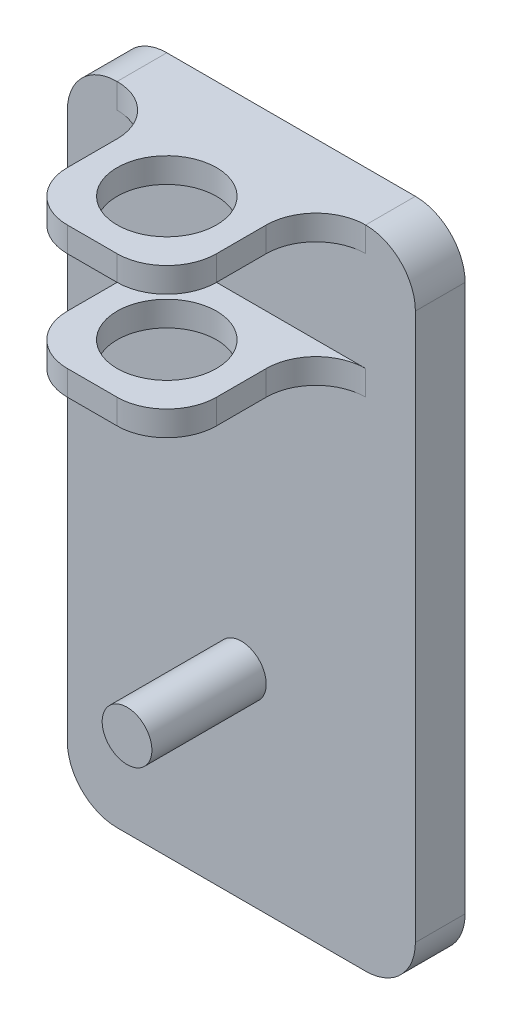
ISO-10303-21;
HEADER;
FILE_DESCRIPTION(('STEP AP214'),'2;1');
FILE_NAME('part.step','',(''),(''),'','','');
FILE_SCHEMA(('AUTOMOTIVE_DESIGN { 1 0 10303 214 1 1 1 1 }'));
ENDSEC;
DATA;
#1=APPLICATION_CONTEXT('core data for automotive mechanical design processes');
#2=APPLICATION_PROTOCOL_DEFINITION('international standard','automotive_design',2000,#1);
#3=PRODUCT_CONTEXT('',#1,'mechanical');
#4=PRODUCT('Part','Part','',(#3));
#5=PRODUCT_RELATED_PRODUCT_CATEGORY('part','',(#4));
#6=PRODUCT_DEFINITION_FORMATION('','',#4);
#7=PRODUCT_DEFINITION_CONTEXT('part definition',#1,'design');
#8=PRODUCT_DEFINITION('design','',#6,#7);
#9=PRODUCT_DEFINITION_SHAPE('','',#8);
#10=(LENGTH_UNIT() NAMED_UNIT(*) SI_UNIT(.MILLI.,.METRE.));
#11=(NAMED_UNIT(*) PLANE_ANGLE_UNIT() SI_UNIT($,.RADIAN.));
#12=(NAMED_UNIT(*) SI_UNIT($,.STERADIAN.) SOLID_ANGLE_UNIT());
#13=UNCERTAINTY_MEASURE_WITH_UNIT(LENGTH_MEASURE(1.E-05),#10,'distance_accuracy_value','');
#14=(GEOMETRIC_REPRESENTATION_CONTEXT(3) GLOBAL_UNCERTAINTY_ASSIGNED_CONTEXT((#13)) GLOBAL_UNIT_ASSIGNED_CONTEXT((#10,
#11,#12)) REPRESENTATION_CONTEXT('',''));
#15=CARTESIAN_POINT('',(0.,0.,0.));
#16=DIRECTION('',(0.,0.,1.));
#17=DIRECTION('',(1.,0.,0.));
#18=AXIS2_PLACEMENT_3D('',#15,#16,#17);
#19=CARTESIAN_POINT('',(35.,65.,5.));
#20=DIRECTION('',(-1.,0.,0.));
#21=DIRECTION('',(0.,-1.,0.));
#22=AXIS2_PLACEMENT_3D('',#19,#20,#21);
#23=PLANE('',#22);
#24=DIRECTION('',(0.,1.,0.));
#25=VECTOR('',#24,1.);
#26=CARTESIAN_POINT('',(35.,65.,5.));
#27=LINE('',#26,#25);
#28=CARTESIAN_POINT('',(35.,-55.,5.));
#29=VERTEX_POINT('',#28);
#30=CARTESIAN_POINT('',(35.,55.,5.));
#31=VERTEX_POINT('',#30);
#32=EDGE_CURVE('E222',#29,#31,#27,.T.);
#33=ORIENTED_EDGE('',*,*,#32,.F.);
#34=DIRECTION('',(0.,0.,-1.));
#35=VECTOR('',#34,1.);
#36=CARTESIAN_POINT('',(35.,-55.,5.));
#37=LINE('',#36,#35);
#38=CARTESIAN_POINT('',(35.,-55.,-5.));
#39=VERTEX_POINT('',#38);
#40=EDGE_CURVE('E206',#29,#39,#37,.T.);
#41=ORIENTED_EDGE('',*,*,#40,.T.);
#42=DIRECTION('',(0.,1.,0.));
#43=VECTOR('',#42,1.);
#44=CARTESIAN_POINT('',(35.,65.,-5.));
#45=LINE('',#44,#43);
#46=CARTESIAN_POINT('',(35.,55.,-5.));
#47=VERTEX_POINT('',#46);
#48=EDGE_CURVE('E219',#39,#47,#45,.T.);
#49=ORIENTED_EDGE('',*,*,#48,.T.);
#50=DIRECTION('',(0.,0.,-1.));
#51=VECTOR('',#50,1.);
#52=CARTESIAN_POINT('',(35.,55.,5.));
#53=LINE('',#52,#51);
#54=EDGE_CURVE('E225',#47,#31,#53,.F.);
#55=ORIENTED_EDGE('',*,*,#54,.T.);
#56=EDGE_LOOP('',(#33,#41,#49,#55));
#57=FACE_BOUND('',#56,.T.);
#58=ADVANCED_FACE('F45',(#57),#23,.F.);
#59=CARTESIAN_POINT('',(-35.,65.,5.));
#60=DIRECTION('',(0.,-1.,0.));
#61=DIRECTION('',(0.,0.,-1.));
#62=AXIS2_PLACEMENT_3D('',#59,#60,#61);
#63=PLANE('',#62);
#64=CARTESIAN_POINT('',(0.,65.,20.));
#65=DIRECTION('',(0.,-1.,0.));
#66=DIRECTION('',(0.,0.,-1.));
#67=AXIS2_PLACEMENT_3D('',#64,#65,#66);
#68=CIRCLE('',#67,10.);
#69=CARTESIAN_POINT('',(0.,65.,9.99999999999999));
#70=VERTEX_POINT('',#69);
#71=EDGE_CURVE('E598',#70,#70,#68,.T.);
#72=ORIENTED_EDGE('',*,*,#71,.T.);
#73=EDGE_LOOP('',(#72));
#74=FACE_BOUND('',#73,.T.);
#75=DIRECTION('',(0.,0.,1.));
#76=VECTOR('',#75,1.);
#77=CARTESIAN_POINT('',(-15.,65.,5.));
#78=LINE('',#77,#76);
#79=CARTESIAN_POINT('',(-15.,65.,15.));
#80=VERTEX_POINT('',#79);
#81=CARTESIAN_POINT('',(-15.,65.,25.));
#82=VERTEX_POINT('',#81);
#83=EDGE_CURVE('E432',#80,#82,#78,.T.);
#84=ORIENTED_EDGE('',*,*,#83,.T.);
#85=CARTESIAN_POINT('',(-5.,65.,25.));
#86=DIRECTION('',(0.,-1.,0.));
#87=DIRECTION('',(0.,0.,-1.));
#88=AXIS2_PLACEMENT_3D('',#85,#86,#87);
#89=CIRCLE('',#88,10.);
#90=CARTESIAN_POINT('',(-5.,65.,35.));
#91=VERTEX_POINT('',#90);
#92=EDGE_CURVE('E324',#82,#91,#89,.F.);
#93=ORIENTED_EDGE('',*,*,#92,.T.);
#94=DIRECTION('',(-1.,0.,0.));
#95=VECTOR('',#94,1.);
#96=CARTESIAN_POINT('',(-15.,65.,35.));
#97=LINE('',#96,#95);
#98=CARTESIAN_POINT('',(5.,65.,35.));
#99=VERTEX_POINT('',#98);
#100=EDGE_CURVE('E424',#99,#91,#97,.T.);
#101=ORIENTED_EDGE('',*,*,#100,.F.);
#102=CARTESIAN_POINT('',(5.,65.,25.));
#103=DIRECTION('',(0.,-1.,0.));
#104=DIRECTION('',(0.,0.,-1.));
#105=AXIS2_PLACEMENT_3D('',#102,#103,#104);
#106=CIRCLE('',#105,10.);
#107=CARTESIAN_POINT('',(15.,65.,25.));
#108=VERTEX_POINT('',#107);
#109=EDGE_CURVE('E321',#99,#108,#106,.F.);
#110=ORIENTED_EDGE('',*,*,#109,.T.);
#111=DIRECTION('',(0.,0.,1.));
#112=VECTOR('',#111,1.);
#113=CARTESIAN_POINT('',(15.,65.,5.));
#114=LINE('',#113,#112);
#115=CARTESIAN_POINT('',(15.,65.,15.));
#116=VERTEX_POINT('',#115);
#117=EDGE_CURVE('E436',#116,#108,#114,.T.);
#118=ORIENTED_EDGE('',*,*,#117,.F.);
#119=CARTESIAN_POINT('',(25.,65.,15.));
#120=DIRECTION('',(0.,-1.,0.));
#121=DIRECTION('',(0.,0.,-1.));
#122=AXIS2_PLACEMENT_3D('',#119,#120,#121);
#123=CIRCLE('',#122,10.);
#124=CARTESIAN_POINT('',(25.,65.,5.));
#125=VERTEX_POINT('',#124);
#126=EDGE_CURVE('E341',#116,#125,#123,.T.);
#127=ORIENTED_EDGE('',*,*,#126,.T.);
#128=DIRECTION('',(0.,0.,-1.));
#129=VECTOR('',#128,1.);
#130=CARTESIAN_POINT('',(25.,65.,5.));
#131=LINE('',#130,#129);
#132=CARTESIAN_POINT('',(25.,65.,-5.));
#133=VERTEX_POINT('',#132);
#134=EDGE_CURVE('E285',#125,#133,#131,.T.);
#135=ORIENTED_EDGE('',*,*,#134,.T.);
#136=DIRECTION('',(-1.,0.,0.));
#137=VECTOR('',#136,1.);
#138=CARTESIAN_POINT('',(-35.,65.,-5.));
#139=LINE('',#138,#137);
#140=CARTESIAN_POINT('',(-25.,65.,-5.));
#141=VERTEX_POINT('',#140);
#142=EDGE_CURVE('E230',#133,#141,#139,.T.);
#143=ORIENTED_EDGE('',*,*,#142,.T.);
#144=DIRECTION('',(0.,0.,-1.));
#145=VECTOR('',#144,1.);
#146=CARTESIAN_POINT('',(-25.,65.,5.));
#147=LINE('',#146,#145);
#148=CARTESIAN_POINT('',(-25.,65.,5.));
#149=VERTEX_POINT('',#148);
#150=EDGE_CURVE('E289',#141,#149,#147,.F.);
#151=ORIENTED_EDGE('',*,*,#150,.T.);
#152=CARTESIAN_POINT('',(-25.,65.,15.));
#153=DIRECTION('',(0.,-1.,0.));
#154=DIRECTION('',(0.,0.,-1.));
#155=AXIS2_PLACEMENT_3D('',#152,#153,#154);
#156=CIRCLE('',#155,10.);
#157=EDGE_CURVE('E338',#149,#80,#156,.T.);
#158=ORIENTED_EDGE('',*,*,#157,.T.);
#159=EDGE_LOOP('',(#84,#93,#101,#110,#118,#127,#135,#143,#151,#158));
#160=FACE_BOUND('',#159,.T.);
#161=ADVANCED_FACE('F476',(#74,#160),#63,.F.);
#162=CARTESIAN_POINT('',(-35.,65.,5.));
#163=DIRECTION('',(1.,0.,0.));
#164=DIRECTION('',(0.,1.,0.));
#165=AXIS2_PLACEMENT_3D('',#162,#163,#164);
#166=PLANE('',#165);
#167=DIRECTION('',(0.,-1.,0.));
#168=VECTOR('',#167,1.);
#169=CARTESIAN_POINT('',(-35.,65.,-5.));
#170=LINE('',#169,#168);
#171=CARTESIAN_POINT('',(-35.,55.,-5.));
#172=VERTEX_POINT('',#171);
#173=CARTESIAN_POINT('',(-35.,-55.,-5.));
#174=VERTEX_POINT('',#173);
#175=EDGE_CURVE('E236',#172,#174,#170,.T.);
#176=ORIENTED_EDGE('',*,*,#175,.T.);
#177=DIRECTION('',(0.,0.,-1.));
#178=VECTOR('',#177,1.);
#179=CARTESIAN_POINT('',(-35.,-55.,5.));
#180=LINE('',#179,#178);
#181=CARTESIAN_POINT('',(-35.,-55.,5.));
#182=VERTEX_POINT('',#181);
#183=EDGE_CURVE('E282',#174,#182,#180,.F.);
#184=ORIENTED_EDGE('',*,*,#183,.T.);
#185=DIRECTION('',(0.,-1.,0.));
#186=VECTOR('',#185,1.);
#187=CARTESIAN_POINT('',(-35.,65.,5.));
#188=LINE('',#187,#186);
#189=CARTESIAN_POINT('',(-35.,55.,5.));
#190=VERTEX_POINT('',#189);
#191=EDGE_CURVE('E451',#190,#182,#188,.T.);
#192=ORIENTED_EDGE('',*,*,#191,.F.);
#193=DIRECTION('',(0.,0.,-1.));
#194=VECTOR('',#193,1.);
#195=CARTESIAN_POINT('',(-35.,55.,5.));
#196=LINE('',#195,#194);
#197=EDGE_CURVE('E278',#190,#172,#196,.T.);
#198=ORIENTED_EDGE('',*,*,#197,.T.);
#199=EDGE_LOOP('',(#176,#184,#192,#198));
#200=FACE_BOUND('',#199,.T.);
#201=ADVANCED_FACE('F468',(#200),#166,.F.);
#202=CARTESIAN_POINT('',(-35.,-65.,5.));
#203=DIRECTION('',(0.,1.,0.));
#204=DIRECTION('',(0.,0.,1.));
#205=AXIS2_PLACEMENT_3D('',#202,#203,#204);
#206=PLANE('',#205);
#207=DIRECTION('',(1.,0.,0.));
#208=VECTOR('',#207,1.);
#209=CARTESIAN_POINT('',(-35.,-65.,-5.));
#210=LINE('',#209,#208);
#211=CARTESIAN_POINT('',(-25.,-65.,-5.));
#212=VERTEX_POINT('',#211);
#213=CARTESIAN_POINT('',(25.,-65.,-5.));
#214=VERTEX_POINT('',#213);
#215=EDGE_CURVE('E248',#212,#214,#210,.T.);
#216=ORIENTED_EDGE('',*,*,#215,.T.);
#217=DIRECTION('',(0.,0.,-1.));
#218=VECTOR('',#217,1.);
#219=CARTESIAN_POINT('',(25.,-65.,5.));
#220=LINE('',#219,#218);
#221=CARTESIAN_POINT('',(25.,-65.,5.));
#222=VERTEX_POINT('',#221);
#223=EDGE_CURVE('E207',#214,#222,#220,.F.);
#224=ORIENTED_EDGE('',*,*,#223,.T.);
#225=DIRECTION('',(1.,0.,0.));
#226=VECTOR('',#225,1.);
#227=CARTESIAN_POINT('',(-35.,-65.,5.));
#228=LINE('',#227,#226);
#229=CARTESIAN_POINT('',(-25.,-65.,5.));
#230=VERTEX_POINT('',#229);
#231=EDGE_CURVE('E242',#230,#222,#228,.T.);
#232=ORIENTED_EDGE('',*,*,#231,.F.);
#233=DIRECTION('',(0.,0.,-1.));
#234=VECTOR('',#233,1.);
#235=CARTESIAN_POINT('',(-25.,-65.,5.));
#236=LINE('',#235,#234);
#237=EDGE_CURVE('E213',#230,#212,#236,.T.);
#238=ORIENTED_EDGE('',*,*,#237,.T.);
#239=EDGE_LOOP('',(#216,#224,#232,#238));
#240=FACE_BOUND('',#239,.T.);
#241=ADVANCED_FACE('F462',(#240),#206,.F.);
#242=CARTESIAN_POINT('',(0.,0.,5.));
#243=DIRECTION('',(0.,0.,1.));
#244=DIRECTION('',(1.,0.,0.));
#245=AXIS2_PLACEMENT_3D('',#242,#243,#244);
#246=PLANE('',#245);
#247=DIRECTION('',(1.,0.,0.));
#248=VECTOR('',#247,1.);
#249=CARTESIAN_POINT('',(-15.,35.,5.));
#250=LINE('',#249,#248);
#251=CARTESIAN_POINT('',(-25.,35.,5.));
#252=VERTEX_POINT('',#251);
#253=CARTESIAN_POINT('',(25.,35.,5.));
#254=VERTEX_POINT('',#253);
#255=EDGE_CURVE('E403',#252,#254,#250,.T.);
#256=ORIENTED_EDGE('',*,*,#255,.F.);
#257=DIRECTION('',(0.,-1.,0.));
#258=VECTOR('',#257,1.);
#259=CARTESIAN_POINT('',(-25.,40.,5.));
#260=LINE('',#259,#258);
#261=CARTESIAN_POINT('',(-25.,40.,5.));
#262=VERTEX_POINT('',#261);
#263=EDGE_CURVE('E358',#252,#262,#260,.F.);
#264=ORIENTED_EDGE('',*,*,#263,.T.);
#265=DIRECTION('',(-1.,0.,0.));
#266=VECTOR('',#265,1.);
#267=CARTESIAN_POINT('',(-15.,40.,5.));
#268=LINE('',#267,#266);
#269=CARTESIAN_POINT('',(25.,40.,5.));
#270=VERTEX_POINT('',#269);
#271=EDGE_CURVE('E396',#270,#262,#268,.T.);
#272=ORIENTED_EDGE('',*,*,#271,.F.);
#273=DIRECTION('',(0.,1.,0.));
#274=VECTOR('',#273,1.);
#275=CARTESIAN_POINT('',(25.,35.,5.));
#276=LINE('',#275,#274);
#277=EDGE_CURVE('E354',#270,#254,#276,.F.);
#278=ORIENTED_EDGE('',*,*,#277,.T.);
#279=EDGE_LOOP('',(#256,#264,#272,#278));
#280=FACE_BOUND('',#279,.T.);
#281=DIRECTION('',(1.,0.,0.));
#282=VECTOR('',#281,1.);
#283=CARTESIAN_POINT('',(-15.,60.,5.));
#284=LINE('',#283,#282);
#285=CARTESIAN_POINT('',(-25.,60.,5.));
#286=VERTEX_POINT('',#285);
#287=CARTESIAN_POINT('',(25.,60.,5.));
#288=VERTEX_POINT('',#287);
#289=EDGE_CURVE('E420',#286,#288,#284,.T.);
#290=ORIENTED_EDGE('',*,*,#289,.F.);
#291=DIRECTION('',(0.,-1.,0.));
#292=VECTOR('',#291,1.);
#293=CARTESIAN_POINT('',(-25.,65.,5.));
#294=LINE('',#293,#292);
#295=EDGE_CURVE('E304',#286,#149,#294,.F.);
#296=ORIENTED_EDGE('',*,*,#295,.T.);
#297=CARTESIAN_POINT('',(-25.,55.,5.));
#298=DIRECTION('',(0.,0.,1.));
#299=DIRECTION('',(1.,0.,0.));
#300=AXIS2_PLACEMENT_3D('',#297,#298,#299);
#301=CIRCLE('',#300,10.);
#302=EDGE_CURVE('E269',#149,#190,#301,.T.);
#303=ORIENTED_EDGE('',*,*,#302,.T.);
#304=ORIENTED_EDGE('',*,*,#191,.T.);
#305=CARTESIAN_POINT('',(-25.,-55.,5.));
#306=DIRECTION('',(0.,0.,1.));
#307=DIRECTION('',(1.,0.,0.));
#308=AXIS2_PLACEMENT_3D('',#305,#306,#307);
#309=CIRCLE('',#308,10.);
#310=EDGE_CURVE('E272',#182,#230,#309,.T.);
#311=ORIENTED_EDGE('',*,*,#310,.T.);
#312=ORIENTED_EDGE('',*,*,#231,.T.);
#313=CARTESIAN_POINT('',(25.,-55.,5.));
#314=DIRECTION('',(0.,0.,1.));
#315=DIRECTION('',(1.,0.,0.));
#316=AXIS2_PLACEMENT_3D('',#313,#314,#315);
#317=CIRCLE('',#316,10.);
#318=EDGE_CURVE('E275',#222,#29,#317,.T.);
#319=ORIENTED_EDGE('',*,*,#318,.T.);
#320=ORIENTED_EDGE('',*,*,#32,.T.);
#321=CARTESIAN_POINT('',(25.,55.,5.));
#322=DIRECTION('',(0.,0.,1.));
#323=DIRECTION('',(1.,0.,0.));
#324=AXIS2_PLACEMENT_3D('',#321,#322,#323);
#325=CIRCLE('',#324,10.);
#326=EDGE_CURVE('E265',#31,#125,#325,.T.);
#327=ORIENTED_EDGE('',*,*,#326,.T.);
#328=DIRECTION('',(0.,1.,0.));
#329=VECTOR('',#328,1.);
#330=CARTESIAN_POINT('',(25.,60.,5.));
#331=LINE('',#330,#329);
#332=EDGE_CURVE('E300',#125,#288,#331,.F.);
#333=ORIENTED_EDGE('',*,*,#332,.T.);
#334=EDGE_LOOP('',(#290,#296,#303,#304,#311,#312,#319,#320,#327,#333));
#335=FACE_BOUND('',#334,.T.);
#336=CARTESIAN_POINT('',(0.,-25.,5.));
#337=DIRECTION('',(0.,0.,1.));
#338=DIRECTION('',(1.,0.,0.));
#339=AXIS2_PLACEMENT_3D('',#336,#337,#338);
#340=CIRCLE('',#339,5.);
#341=CARTESIAN_POINT('',(5.,-25.,5.));
#342=VERTEX_POINT('',#341);
#343=EDGE_CURVE('E239',#342,#342,#340,.T.);
#344=ORIENTED_EDGE('',*,*,#343,.F.);
#345=EDGE_LOOP('',(#344));
#346=FACE_BOUND('',#345,.T.);
#347=ADVANCED_FACE('F401',(#280,#335,#346),#246,.T.);
#348=CARTESIAN_POINT('',(0.,0.,-5.));
#349=DIRECTION('',(0.,0.,1.));
#350=DIRECTION('',(1.,0.,0.));
#351=AXIS2_PLACEMENT_3D('',#348,#349,#350);
#352=PLANE('',#351);
#353=ORIENTED_EDGE('',*,*,#48,.F.);
#354=CARTESIAN_POINT('',(25.,-55.,-5.));
#355=DIRECTION('',(0.,0.,1.));
#356=DIRECTION('',(1.,0.,0.));
#357=AXIS2_PLACEMENT_3D('',#354,#355,#356);
#358=CIRCLE('',#357,10.);
#359=EDGE_CURVE('E202',#39,#214,#358,.F.);
#360=ORIENTED_EDGE('',*,*,#359,.T.);
#361=ORIENTED_EDGE('',*,*,#215,.F.);
#362=CARTESIAN_POINT('',(-25.,-55.,-5.));
#363=DIRECTION('',(0.,0.,1.));
#364=DIRECTION('',(1.,0.,0.));
#365=AXIS2_PLACEMENT_3D('',#362,#363,#364);
#366=CIRCLE('',#365,10.);
#367=EDGE_CURVE('E214',#212,#174,#366,.F.);
#368=ORIENTED_EDGE('',*,*,#367,.T.);
#369=ORIENTED_EDGE('',*,*,#175,.F.);
#370=CARTESIAN_POINT('',(-25.,55.,-5.));
#371=DIRECTION('',(0.,0.,1.));
#372=DIRECTION('',(1.,0.,0.));
#373=AXIS2_PLACEMENT_3D('',#370,#371,#372);
#374=CIRCLE('',#373,10.);
#375=EDGE_CURVE('E255',#172,#141,#374,.F.);
#376=ORIENTED_EDGE('',*,*,#375,.T.);
#377=ORIENTED_EDGE('',*,*,#142,.F.);
#378=CARTESIAN_POINT('',(25.,55.,-5.));
#379=DIRECTION('',(0.,0.,1.));
#380=DIRECTION('',(1.,0.,0.));
#381=AXIS2_PLACEMENT_3D('',#378,#379,#380);
#382=CIRCLE('',#381,10.);
#383=EDGE_CURVE('E224',#133,#47,#382,.F.);
#384=ORIENTED_EDGE('',*,*,#383,.T.);
#385=EDGE_LOOP('',(#353,#360,#361,#368,#369,#376,#377,#384));
#386=FACE_BOUND('',#385,.T.);
#387=ADVANCED_FACE('F227',(#386),#352,.F.);
#388=CARTESIAN_POINT('',(25.,-55.,5.));
#389=DIRECTION('',(0.,0.,-1.));
#390=DIRECTION('',(-1.,0.,0.));
#391=AXIS2_PLACEMENT_3D('',#388,#389,#390);
#392=CYLINDRICAL_SURFACE('',#391,10.);
#393=ORIENTED_EDGE('',*,*,#318,.F.);
#394=ORIENTED_EDGE('',*,*,#223,.F.);
#395=ORIENTED_EDGE('',*,*,#359,.F.);
#396=ORIENTED_EDGE('',*,*,#40,.F.);
#397=EDGE_LOOP('',(#393,#394,#395,#396));
#398=FACE_BOUND('',#397,.T.);
#399=ADVANCED_FACE('F205',(#398),#392,.T.);
#400=CARTESIAN_POINT('',(-25.,-55.,5.));
#401=DIRECTION('',(0.,0.,-1.));
#402=DIRECTION('',(-1.,0.,0.));
#403=AXIS2_PLACEMENT_3D('',#400,#401,#402);
#404=CYLINDRICAL_SURFACE('',#403,10.);
#405=ORIENTED_EDGE('',*,*,#310,.F.);
#406=ORIENTED_EDGE('',*,*,#183,.F.);
#407=ORIENTED_EDGE('',*,*,#367,.F.);
#408=ORIENTED_EDGE('',*,*,#237,.F.);
#409=EDGE_LOOP('',(#405,#406,#407,#408));
#410=FACE_BOUND('',#409,.T.);
#411=ADVANCED_FACE('F464',(#410),#404,.T.);
#412=CARTESIAN_POINT('',(-25.,55.,5.));
#413=DIRECTION('',(0.,0.,-1.));
#414=DIRECTION('',(-1.,0.,0.));
#415=AXIS2_PLACEMENT_3D('',#412,#413,#414);
#416=CYLINDRICAL_SURFACE('',#415,10.);
#417=ORIENTED_EDGE('',*,*,#302,.F.);
#418=ORIENTED_EDGE('',*,*,#150,.F.);
#419=ORIENTED_EDGE('',*,*,#375,.F.);
#420=ORIENTED_EDGE('',*,*,#197,.F.);
#421=EDGE_LOOP('',(#417,#418,#419,#420));
#422=FACE_BOUND('',#421,.T.);
#423=ADVANCED_FACE('F472',(#422),#416,.T.);
#424=CARTESIAN_POINT('',(25.,55.,5.));
#425=DIRECTION('',(0.,0.,-1.));
#426=DIRECTION('',(-1.,0.,0.));
#427=AXIS2_PLACEMENT_3D('',#424,#425,#426);
#428=CYLINDRICAL_SURFACE('',#427,10.);
#429=ORIENTED_EDGE('',*,*,#326,.F.);
#430=ORIENTED_EDGE('',*,*,#54,.F.);
#431=ORIENTED_EDGE('',*,*,#383,.F.);
#432=ORIENTED_EDGE('',*,*,#134,.F.);
#433=EDGE_LOOP('',(#429,#430,#431,#432));
#434=FACE_BOUND('',#433,.T.);
#435=ADVANCED_FACE('F482',(#434),#428,.T.);
#436=CARTESIAN_POINT('',(0.,-25.,28.));
#437=DIRECTION('',(0.,0.,-1.));
#438=DIRECTION('',(-1.,0.,0.));
#439=AXIS2_PLACEMENT_3D('',#436,#437,#438);
#440=CYLINDRICAL_SURFACE('',#439,5.);
#441=CARTESIAN_POINT('',(0.,-25.,28.));
#442=DIRECTION('',(0.,0.,1.));
#443=DIRECTION('',(1.,0.,0.));
#444=AXIS2_PLACEMENT_3D('',#441,#442,#443);
#445=CIRCLE('',#444,5.);
#446=CARTESIAN_POINT('',(5.,-25.,28.));
#447=VERTEX_POINT('',#446);
#448=EDGE_CURVE('E231',#447,#447,#445,.T.);
#449=ORIENTED_EDGE('',*,*,#448,.F.);
#450=EDGE_LOOP('',(#449));
#451=FACE_BOUND('',#450,.T.);
#452=ORIENTED_EDGE('',*,*,#343,.T.);
#453=EDGE_LOOP('',(#452));
#454=FACE_BOUND('',#453,.T.);
#455=ADVANCED_FACE('F543',(#451,#454),#440,.T.);
#456=CARTESIAN_POINT('',(0.,-25.,28.));
#457=DIRECTION('',(0.,0.,1.));
#458=DIRECTION('',(1.,0.,0.));
#459=AXIS2_PLACEMENT_3D('',#456,#457,#458);
#460=PLANE('',#459);
#461=ORIENTED_EDGE('',*,*,#448,.T.);
#462=EDGE_LOOP('',(#461));
#463=FACE_BOUND('',#462,.T.);
#464=ADVANCED_FACE('F522',(#463),#460,.T.);
#465=CARTESIAN_POINT('',(-15.,65.,5.));
#466=DIRECTION('',(-1.,0.,0.));
#467=DIRECTION('',(0.,-1.,0.));
#468=AXIS2_PLACEMENT_3D('',#465,#466,#467);
#469=PLANE('',#468);
#470=ORIENTED_EDGE('',*,*,#83,.F.);
#471=DIRECTION('',(0.,-1.,0.));
#472=VECTOR('',#471,1.);
#473=CARTESIAN_POINT('',(-15.,60.,15.));
#474=LINE('',#473,#472);
#475=CARTESIAN_POINT('',(-15.,60.,15.));
#476=VERTEX_POINT('',#475);
#477=EDGE_CURVE('E296',#80,#476,#474,.T.);
#478=ORIENTED_EDGE('',*,*,#477,.T.);
#479=DIRECTION('',(0.,0.,1.));
#480=VECTOR('',#479,1.);
#481=CARTESIAN_POINT('',(-15.,60.,5.));
#482=LINE('',#481,#480);
#483=CARTESIAN_POINT('',(-15.,60.,25.));
#484=VERTEX_POINT('',#483);
#485=EDGE_CURVE('E423',#476,#484,#482,.T.);
#486=ORIENTED_EDGE('',*,*,#485,.T.);
#487=DIRECTION('',(0.,-1.,0.));
#488=VECTOR('',#487,1.);
#489=CARTESIAN_POINT('',(-15.,65.,25.));
#490=LINE('',#489,#488);
#491=EDGE_CURVE('E293',#484,#82,#490,.F.);
#492=ORIENTED_EDGE('',*,*,#491,.T.);
#493=EDGE_LOOP('',(#470,#478,#486,#492));
#494=FACE_BOUND('',#493,.T.);
#495=ADVANCED_FACE('F498',(#494),#469,.T.);
#496=CARTESIAN_POINT('',(15.,65.,5.));
#497=DIRECTION('',(1.,0.,0.));
#498=DIRECTION('',(0.,1.,0.));
#499=AXIS2_PLACEMENT_3D('',#496,#497,#498);
#500=PLANE('',#499);
#501=DIRECTION('',(0.,0.,1.));
#502=VECTOR('',#501,1.);
#503=CARTESIAN_POINT('',(15.,60.,5.));
#504=LINE('',#503,#502);
#505=CARTESIAN_POINT('',(15.,60.,15.));
#506=VERTEX_POINT('',#505);
#507=CARTESIAN_POINT('',(15.,60.,25.));
#508=VERTEX_POINT('',#507);
#509=EDGE_CURVE('E440',#506,#508,#504,.T.);
#510=ORIENTED_EDGE('',*,*,#509,.F.);
#511=DIRECTION('',(0.,1.,0.));
#512=VECTOR('',#511,1.);
#513=CARTESIAN_POINT('',(15.,65.,15.));
#514=LINE('',#513,#512);
#515=EDGE_CURVE('E330',#506,#116,#514,.T.);
#516=ORIENTED_EDGE('',*,*,#515,.T.);
#517=ORIENTED_EDGE('',*,*,#117,.T.);
#518=DIRECTION('',(0.,1.,0.));
#519=VECTOR('',#518,1.);
#520=CARTESIAN_POINT('',(15.,65.,25.));
#521=LINE('',#520,#519);
#522=EDGE_CURVE('E327',#108,#508,#521,.F.);
#523=ORIENTED_EDGE('',*,*,#522,.T.);
#524=EDGE_LOOP('',(#510,#516,#517,#523));
#525=FACE_BOUND('',#524,.T.);
#526=ADVANCED_FACE('F513',(#525),#500,.T.);
#527=CARTESIAN_POINT('',(-15.,60.,5.));
#528=DIRECTION('',(0.,-1.,0.));
#529=DIRECTION('',(0.,0.,-1.));
#530=AXIS2_PLACEMENT_3D('',#527,#528,#529);
#531=PLANE('',#530);
#532=CARTESIAN_POINT('',(0.,60.,20.));
#533=DIRECTION('',(0.,-1.,0.));
#534=DIRECTION('',(0.,0.,-1.));
#535=AXIS2_PLACEMENT_3D('',#532,#533,#534);
#536=CIRCLE('',#535,10.);
#537=CARTESIAN_POINT('',(0.,60.,9.99999999999999));
#538=VERTEX_POINT('',#537);
#539=EDGE_CURVE('E586',#538,#538,#536,.T.);
#540=ORIENTED_EDGE('',*,*,#539,.F.);
#541=EDGE_LOOP('',(#540));
#542=FACE_BOUND('',#541,.T.);
#543=DIRECTION('',(1.,0.,0.));
#544=VECTOR('',#543,1.);
#545=CARTESIAN_POINT('',(-15.,60.,35.));
#546=LINE('',#545,#544);
#547=CARTESIAN_POINT('',(-5.,60.,35.));
#548=VERTEX_POINT('',#547);
#549=CARTESIAN_POINT('',(5.,60.,35.));
#550=VERTEX_POINT('',#549);
#551=EDGE_CURVE('E425',#548,#550,#546,.T.);
#552=ORIENTED_EDGE('',*,*,#551,.F.);
#553=CARTESIAN_POINT('',(-5.,60.,25.));
#554=DIRECTION('',(0.,-1.,0.));
#555=DIRECTION('',(0.,0.,-1.));
#556=AXIS2_PLACEMENT_3D('',#553,#554,#555);
#557=CIRCLE('',#556,10.);
#558=EDGE_CURVE('E318',#548,#484,#557,.T.);
#559=ORIENTED_EDGE('',*,*,#558,.T.);
#560=ORIENTED_EDGE('',*,*,#485,.F.);
#561=CARTESIAN_POINT('',(-25.,60.,15.));
#562=DIRECTION('',(0.,-1.,0.));
#563=DIRECTION('',(0.,0.,-1.));
#564=AXIS2_PLACEMENT_3D('',#561,#562,#563);
#565=CIRCLE('',#564,10.);
#566=EDGE_CURVE('E334',#476,#286,#565,.F.);
#567=ORIENTED_EDGE('',*,*,#566,.T.);
#568=ORIENTED_EDGE('',*,*,#289,.T.);
#569=CARTESIAN_POINT('',(25.,60.,15.));
#570=DIRECTION('',(0.,-1.,0.));
#571=DIRECTION('',(0.,0.,-1.));
#572=AXIS2_PLACEMENT_3D('',#569,#570,#571);
#573=CIRCLE('',#572,10.);
#574=EDGE_CURVE('E344',#288,#506,#573,.F.);
#575=ORIENTED_EDGE('',*,*,#574,.T.);
#576=ORIENTED_EDGE('',*,*,#509,.T.);
#577=CARTESIAN_POINT('',(5.,60.,25.));
#578=DIRECTION('',(0.,-1.,0.));
#579=DIRECTION('',(0.,0.,-1.));
#580=AXIS2_PLACEMENT_3D('',#577,#578,#579);
#581=CIRCLE('',#580,10.);
#582=EDGE_CURVE('E315',#508,#550,#581,.T.);
#583=ORIENTED_EDGE('',*,*,#582,.T.);
#584=EDGE_LOOP('',(#552,#559,#560,#567,#568,#575,#576,#583));
#585=FACE_BOUND('',#584,.T.);
#586=ADVANCED_FACE('F491',(#542,#585),#531,.T.);
#587=CARTESIAN_POINT('',(0.,0.,35.));
#588=DIRECTION('',(0.,0.,1.));
#589=DIRECTION('',(1.,0.,0.));
#590=AXIS2_PLACEMENT_3D('',#587,#588,#589);
#591=PLANE('',#590);
#592=ORIENTED_EDGE('',*,*,#100,.T.);
#593=DIRECTION('',(0.,-1.,0.));
#594=VECTOR('',#593,1.);
#595=CARTESIAN_POINT('',(-5.00000000000002,0.,35.));
#596=LINE('',#595,#594);
#597=EDGE_CURVE('E311',#91,#548,#596,.T.);
#598=ORIENTED_EDGE('',*,*,#597,.T.);
#599=ORIENTED_EDGE('',*,*,#551,.T.);
#600=DIRECTION('',(0.,1.,0.));
#601=VECTOR('',#600,1.);
#602=CARTESIAN_POINT('',(5.00000000000002,0.,35.));
#603=LINE('',#602,#601);
#604=EDGE_CURVE('E307',#550,#99,#603,.T.);
#605=ORIENTED_EDGE('',*,*,#604,.T.);
#606=EDGE_LOOP('',(#592,#598,#599,#605));
#607=FACE_BOUND('',#606,.T.);
#608=ADVANCED_FACE('F505',(#607),#591,.T.);
#609=CARTESIAN_POINT('',(-15.,40.,5.));
#610=DIRECTION('',(-1.,0.,0.));
#611=DIRECTION('',(0.,0.,1.));
#612=AXIS2_PLACEMENT_3D('',#609,#610,#611);
#613=PLANE('',#612);
#614=DIRECTION('',(0.,0.,1.));
#615=VECTOR('',#614,1.);
#616=CARTESIAN_POINT('',(-15.,40.,5.));
#617=LINE('',#616,#615);
#618=CARTESIAN_POINT('',(-15.,40.,15.));
#619=VERTEX_POINT('',#618);
#620=CARTESIAN_POINT('',(-15.,40.,25.));
#621=VERTEX_POINT('',#620);
#622=EDGE_CURVE('E583',#619,#621,#617,.T.);
#623=ORIENTED_EDGE('',*,*,#622,.F.);
#624=DIRECTION('',(0.,-1.,0.));
#625=VECTOR('',#624,1.);
#626=CARTESIAN_POINT('',(-15.,35.,15.));
#627=LINE('',#626,#625);
#628=CARTESIAN_POINT('',(-15.,35.,15.));
#629=VERTEX_POINT('',#628);
#630=EDGE_CURVE('E350',#619,#629,#627,.T.);
#631=ORIENTED_EDGE('',*,*,#630,.T.);
#632=DIRECTION('',(0.,0.,1.));
#633=VECTOR('',#632,1.);
#634=CARTESIAN_POINT('',(-15.,35.,5.));
#635=LINE('',#634,#633);
#636=CARTESIAN_POINT('',(-15.,35.,25.));
#637=VERTEX_POINT('',#636);
#638=EDGE_CURVE('E407',#629,#637,#635,.T.);
#639=ORIENTED_EDGE('',*,*,#638,.T.);
#640=DIRECTION('',(0.,-1.,0.));
#641=VECTOR('',#640,1.);
#642=CARTESIAN_POINT('',(-15.,40.,25.));
#643=LINE('',#642,#641);
#644=EDGE_CURVE('E347',#637,#621,#643,.F.);
#645=ORIENTED_EDGE('',*,*,#644,.T.);
#646=EDGE_LOOP('',(#623,#631,#639,#645));
#647=FACE_BOUND('',#646,.T.);
#648=ADVANCED_FACE('F616',(#647),#613,.T.);
#649=CARTESIAN_POINT('',(-15.,40.,5.));
#650=DIRECTION('',(0.,1.,0.));
#651=DIRECTION('',(0.,0.,1.));
#652=AXIS2_PLACEMENT_3D('',#649,#650,#651);
#653=PLANE('',#652);
#654=CARTESIAN_POINT('',(0.,40.,20.));
#655=DIRECTION('',(0.,1.,0.));
#656=DIRECTION('',(0.,0.,1.));
#657=AXIS2_PLACEMENT_3D('',#654,#655,#656);
#658=CIRCLE('',#657,10.);
#659=CARTESIAN_POINT('',(0.,40.,30.));
#660=VERTEX_POINT('',#659);
#661=EDGE_CURVE('E594',#660,#660,#658,.T.);
#662=ORIENTED_EDGE('',*,*,#661,.F.);
#663=EDGE_LOOP('',(#662));
#664=FACE_BOUND('',#663,.T.);
#665=ORIENTED_EDGE('',*,*,#622,.T.);
#666=CARTESIAN_POINT('',(-5.,40.,25.));
#667=DIRECTION('',(0.,1.,0.));
#668=DIRECTION('',(0.,0.,1.));
#669=AXIS2_PLACEMENT_3D('',#666,#667,#668);
#670=CIRCLE('',#669,10.);
#671=CARTESIAN_POINT('',(-5.,40.,35.));
#672=VERTEX_POINT('',#671);
#673=EDGE_CURVE('E378',#621,#672,#670,.T.);
#674=ORIENTED_EDGE('',*,*,#673,.T.);
#675=DIRECTION('',(-1.,0.,0.));
#676=VECTOR('',#675,1.);
#677=CARTESIAN_POINT('',(-15.,40.,35.));
#678=LINE('',#677,#676);
#679=CARTESIAN_POINT('',(5.,40.,35.));
#680=VERTEX_POINT('',#679);
#681=EDGE_CURVE('E411',#680,#672,#678,.T.);
#682=ORIENTED_EDGE('',*,*,#681,.F.);
#683=CARTESIAN_POINT('',(5.,40.,25.));
#684=DIRECTION('',(0.,1.,0.));
#685=DIRECTION('',(0.,0.,1.));
#686=AXIS2_PLACEMENT_3D('',#683,#684,#685);
#687=CIRCLE('',#686,10.);
#688=CARTESIAN_POINT('',(15.,40.,25.));
#689=VERTEX_POINT('',#688);
#690=EDGE_CURVE('E61',#680,#689,#687,.T.);
#691=ORIENTED_EDGE('',*,*,#690,.T.);
#692=DIRECTION('',(0.,0.,1.));
#693=VECTOR('',#692,1.);
#694=CARTESIAN_POINT('',(15.,40.,5.));
#695=LINE('',#694,#693);
#696=CARTESIAN_POINT('',(15.,40.,15.));
#697=VERTEX_POINT('',#696);
#698=EDGE_CURVE('E397',#697,#689,#695,.T.);
#699=ORIENTED_EDGE('',*,*,#698,.F.);
#700=CARTESIAN_POINT('',(25.,40.,15.));
#701=DIRECTION('',(0.,1.,0.));
#702=DIRECTION('',(0.,0.,1.));
#703=AXIS2_PLACEMENT_3D('',#700,#701,#702);
#704=CIRCLE('',#703,10.);
#705=EDGE_CURVE('E54',#697,#270,#704,.F.);
#706=ORIENTED_EDGE('',*,*,#705,.T.);
#707=ORIENTED_EDGE('',*,*,#271,.T.);
#708=CARTESIAN_POINT('',(-25.,40.,15.));
#709=DIRECTION('',(0.,1.,0.));
#710=DIRECTION('',(0.,0.,1.));
#711=AXIS2_PLACEMENT_3D('',#708,#709,#710);
#712=CIRCLE('',#711,10.);
#713=EDGE_CURVE('E391',#262,#619,#712,.F.);
#714=ORIENTED_EDGE('',*,*,#713,.T.);
#715=EDGE_LOOP('',(#665,#674,#682,#691,#699,#706,#707,#714));
#716=FACE_BOUND('',#715,.T.);
#717=ADVANCED_FACE('F395',(#664,#716),#653,.T.);
#718=CARTESIAN_POINT('',(15.,40.,5.));
#719=DIRECTION('',(1.,0.,0.));
#720=DIRECTION('',(0.,0.,-1.));
#721=AXIS2_PLACEMENT_3D('',#718,#719,#720);
#722=PLANE('',#721);
#723=DIRECTION('',(0.,0.,1.));
#724=VECTOR('',#723,1.);
#725=CARTESIAN_POINT('',(15.,35.,5.));
#726=LINE('',#725,#724);
#727=CARTESIAN_POINT('',(15.,35.,15.));
#728=VERTEX_POINT('',#727);
#729=CARTESIAN_POINT('',(15.,35.,25.));
#730=VERTEX_POINT('',#729);
#731=EDGE_CURVE('E414',#728,#730,#726,.T.);
#732=ORIENTED_EDGE('',*,*,#731,.F.);
#733=DIRECTION('',(0.,1.,0.));
#734=VECTOR('',#733,1.);
#735=CARTESIAN_POINT('',(15.,40.,15.));
#736=LINE('',#735,#734);
#737=EDGE_CURVE('E384',#728,#697,#736,.T.);
#738=ORIENTED_EDGE('',*,*,#737,.T.);
#739=ORIENTED_EDGE('',*,*,#698,.T.);
#740=DIRECTION('',(0.,1.,0.));
#741=VECTOR('',#740,1.);
#742=CARTESIAN_POINT('',(15.,40.,25.));
#743=LINE('',#742,#741);
#744=EDGE_CURVE('E381',#689,#730,#743,.F.);
#745=ORIENTED_EDGE('',*,*,#744,.T.);
#746=EDGE_LOOP('',(#732,#738,#739,#745));
#747=FACE_BOUND('',#746,.T.);
#748=ADVANCED_FACE('F622',(#747),#722,.T.);
#749=CARTESIAN_POINT('',(-15.,35.,5.));
#750=DIRECTION('',(0.,-1.,0.));
#751=DIRECTION('',(0.,0.,-1.));
#752=AXIS2_PLACEMENT_3D('',#749,#750,#751);
#753=PLANE('',#752);
#754=CARTESIAN_POINT('',(0.,35.,20.));
#755=DIRECTION('',(0.,-1.,0.));
#756=DIRECTION('',(0.,0.,-1.));
#757=AXIS2_PLACEMENT_3D('',#754,#755,#756);
#758=CIRCLE('',#757,10.);
#759=CARTESIAN_POINT('',(0.,35.,9.99999999999999));
#760=VERTEX_POINT('',#759);
#761=EDGE_CURVE('E599',#760,#760,#758,.T.);
#762=ORIENTED_EDGE('',*,*,#761,.F.);
#763=EDGE_LOOP('',(#762));
#764=FACE_BOUND('',#763,.T.);
#765=DIRECTION('',(1.,0.,0.));
#766=VECTOR('',#765,1.);
#767=CARTESIAN_POINT('',(-15.,35.,35.));
#768=LINE('',#767,#766);
#769=CARTESIAN_POINT('',(-5.,35.,35.));
#770=VERTEX_POINT('',#769);
#771=CARTESIAN_POINT('',(5.,35.,35.));
#772=VERTEX_POINT('',#771);
#773=EDGE_CURVE('E417',#770,#772,#768,.T.);
#774=ORIENTED_EDGE('',*,*,#773,.F.);
#775=CARTESIAN_POINT('',(-5.,35.,25.));
#776=DIRECTION('',(0.,-1.,0.));
#777=DIRECTION('',(0.,0.,-1.));
#778=AXIS2_PLACEMENT_3D('',#775,#776,#777);
#779=CIRCLE('',#778,10.);
#780=EDGE_CURVE('E373',#770,#637,#779,.T.);
#781=ORIENTED_EDGE('',*,*,#780,.T.);
#782=ORIENTED_EDGE('',*,*,#638,.F.);
#783=CARTESIAN_POINT('',(-25.,35.,15.));
#784=DIRECTION('',(0.,-1.,0.));
#785=DIRECTION('',(0.,0.,-1.));
#786=AXIS2_PLACEMENT_3D('',#783,#784,#785);
#787=CIRCLE('',#786,10.);
#788=EDGE_CURVE('E387',#629,#252,#787,.F.);
#789=ORIENTED_EDGE('',*,*,#788,.T.);
#790=ORIENTED_EDGE('',*,*,#255,.T.);
#791=CARTESIAN_POINT('',(25.,35.,15.));
#792=DIRECTION('',(0.,-1.,0.));
#793=DIRECTION('',(0.,0.,-1.));
#794=AXIS2_PLACEMENT_3D('',#791,#792,#793);
#795=CIRCLE('',#794,10.);
#796=EDGE_CURVE('E11',#254,#728,#795,.F.);
#797=ORIENTED_EDGE('',*,*,#796,.T.);
#798=ORIENTED_EDGE('',*,*,#731,.T.);
#799=CARTESIAN_POINT('',(5.,35.,25.));
#800=DIRECTION('',(0.,-1.,0.));
#801=DIRECTION('',(0.,0.,-1.));
#802=AXIS2_PLACEMENT_3D('',#799,#800,#801);
#803=CIRCLE('',#802,10.);
#804=EDGE_CURVE('E370',#730,#772,#803,.T.);
#805=ORIENTED_EDGE('',*,*,#804,.T.);
#806=EDGE_LOOP('',(#774,#781,#782,#789,#790,#797,#798,#805));
#807=FACE_BOUND('',#806,.T.);
#808=ADVANCED_FACE('F574',(#764,#807),#753,.T.);
#809=CARTESIAN_POINT('',(0.,0.,35.));
#810=DIRECTION('',(0.,0.,1.));
#811=DIRECTION('',(1.,0.,0.));
#812=AXIS2_PLACEMENT_3D('',#809,#810,#811);
#813=PLANE('',#812);
#814=ORIENTED_EDGE('',*,*,#681,.T.);
#815=DIRECTION('',(0.,-1.,0.));
#816=VECTOR('',#815,1.);
#817=CARTESIAN_POINT('',(-5.,0.,35.));
#818=LINE('',#817,#816);
#819=EDGE_CURVE('E366',#672,#770,#818,.T.);
#820=ORIENTED_EDGE('',*,*,#819,.T.);
#821=ORIENTED_EDGE('',*,*,#773,.T.);
#822=DIRECTION('',(0.,1.,0.));
#823=VECTOR('',#822,1.);
#824=CARTESIAN_POINT('',(5.,0.,35.));
#825=LINE('',#824,#823);
#826=EDGE_CURVE('E362',#772,#680,#825,.T.);
#827=ORIENTED_EDGE('',*,*,#826,.T.);
#828=EDGE_LOOP('',(#814,#820,#821,#827));
#829=FACE_BOUND('',#828,.T.);
#830=ADVANCED_FACE('F578',(#829),#813,.T.);
#831=CARTESIAN_POINT('',(0.,65.,20.));
#832=DIRECTION('',(0.,-1.,0.));
#833=DIRECTION('',(0.,0.,-1.));
#834=AXIS2_PLACEMENT_3D('',#831,#832,#833);
#835=CYLINDRICAL_SURFACE('',#834,10.);
#836=ORIENTED_EDGE('',*,*,#661,.T.);
#837=EDGE_LOOP('',(#836));
#838=FACE_BOUND('',#837,.T.);
#839=ORIENTED_EDGE('',*,*,#761,.T.);
#840=EDGE_LOOP('',(#839));
#841=FACE_BOUND('',#840,.T.);
#842=ADVANCED_FACE('F608',(#838,#841),#835,.F.);
#843=ORIENTED_EDGE('',*,*,#539,.T.);
#844=EDGE_LOOP('',(#843));
#845=FACE_BOUND('',#844,.T.);
#846=ORIENTED_EDGE('',*,*,#71,.F.);
#847=EDGE_LOOP('',(#846));
#848=FACE_BOUND('',#847,.T.);
#849=ADVANCED_FACE('F546',(#845,#848),#835,.F.);
#850=CARTESIAN_POINT('',(-25.,65.,15.));
#851=DIRECTION('',(0.,1.,0.));
#852=DIRECTION('',(-1.,0.,0.));
#853=AXIS2_PLACEMENT_3D('',#850,#851,#852);
#854=CYLINDRICAL_SURFACE('',#853,10.);
#855=ORIENTED_EDGE('',*,*,#157,.F.);
#856=ORIENTED_EDGE('',*,*,#295,.F.);
#857=ORIENTED_EDGE('',*,*,#566,.F.);
#858=ORIENTED_EDGE('',*,*,#477,.F.);
#859=EDGE_LOOP('',(#855,#856,#857,#858));
#860=FACE_BOUND('',#859,.T.);
#861=ADVANCED_FACE('F494',(#860),#854,.F.);
#862=CARTESIAN_POINT('',(-5.00000000000002,0.,25.));
#863=DIRECTION('',(0.,-1.,0.));
#864=DIRECTION('',(1.,0.,0.));
#865=AXIS2_PLACEMENT_3D('',#862,#863,#864);
#866=CYLINDRICAL_SURFACE('',#865,10.);
#867=ORIENTED_EDGE('',*,*,#92,.F.);
#868=ORIENTED_EDGE('',*,*,#491,.F.);
#869=ORIENTED_EDGE('',*,*,#558,.F.);
#870=ORIENTED_EDGE('',*,*,#597,.F.);
#871=EDGE_LOOP('',(#867,#868,#869,#870));
#872=FACE_BOUND('',#871,.T.);
#873=ADVANCED_FACE('F501',(#872),#866,.T.);
#874=CARTESIAN_POINT('',(25.,65.,15.));
#875=DIRECTION('',(0.,-1.,0.));
#876=DIRECTION('',(1.,0.,0.));
#877=AXIS2_PLACEMENT_3D('',#874,#875,#876);
#878=CYLINDRICAL_SURFACE('',#877,10.);
#879=ORIENTED_EDGE('',*,*,#574,.F.);
#880=ORIENTED_EDGE('',*,*,#332,.F.);
#881=ORIENTED_EDGE('',*,*,#126,.F.);
#882=ORIENTED_EDGE('',*,*,#515,.F.);
#883=EDGE_LOOP('',(#879,#880,#881,#882));
#884=FACE_BOUND('',#883,.T.);
#885=ADVANCED_FACE('F485',(#884),#878,.F.);
#886=CARTESIAN_POINT('',(5.00000000000002,0.,25.));
#887=DIRECTION('',(0.,1.,0.));
#888=DIRECTION('',(-1.,0.,0.));
#889=AXIS2_PLACEMENT_3D('',#886,#887,#888);
#890=CYLINDRICAL_SURFACE('',#889,10.);
#891=ORIENTED_EDGE('',*,*,#582,.F.);
#892=ORIENTED_EDGE('',*,*,#522,.F.);
#893=ORIENTED_EDGE('',*,*,#109,.F.);
#894=ORIENTED_EDGE('',*,*,#604,.F.);
#895=EDGE_LOOP('',(#891,#892,#893,#894));
#896=FACE_BOUND('',#895,.T.);
#897=ADVANCED_FACE('F509',(#896),#890,.T.);
#898=CARTESIAN_POINT('',(-25.,40.,15.));
#899=DIRECTION('',(0.,1.,0.));
#900=DIRECTION('',(0.,0.,1.));
#901=AXIS2_PLACEMENT_3D('',#898,#899,#900);
#902=CYLINDRICAL_SURFACE('',#901,10.);
#903=ORIENTED_EDGE('',*,*,#713,.F.);
#904=ORIENTED_EDGE('',*,*,#263,.F.);
#905=ORIENTED_EDGE('',*,*,#788,.F.);
#906=ORIENTED_EDGE('',*,*,#630,.F.);
#907=EDGE_LOOP('',(#903,#904,#905,#906));
#908=FACE_BOUND('',#907,.T.);
#909=ADVANCED_FACE('F553',(#908),#902,.F.);
#910=CARTESIAN_POINT('',(-5.,0.,25.));
#911=DIRECTION('',(0.,-1.,0.));
#912=DIRECTION('',(0.,0.,-1.));
#913=AXIS2_PLACEMENT_3D('',#910,#911,#912);
#914=CYLINDRICAL_SURFACE('',#913,10.);
#915=ORIENTED_EDGE('',*,*,#673,.F.);
#916=ORIENTED_EDGE('',*,*,#644,.F.);
#917=ORIENTED_EDGE('',*,*,#780,.F.);
#918=ORIENTED_EDGE('',*,*,#819,.F.);
#919=EDGE_LOOP('',(#915,#916,#917,#918));
#920=FACE_BOUND('',#919,.T.);
#921=ADVANCED_FACE('F556',(#920),#914,.T.);
#922=CARTESIAN_POINT('',(25.,40.,15.));
#923=DIRECTION('',(0.,-1.,0.));
#924=DIRECTION('',(0.,0.,-1.));
#925=AXIS2_PLACEMENT_3D('',#922,#923,#924);
#926=CYLINDRICAL_SURFACE('',#925,10.);
#927=ORIENTED_EDGE('',*,*,#796,.F.);
#928=ORIENTED_EDGE('',*,*,#277,.F.);
#929=ORIENTED_EDGE('',*,*,#705,.F.);
#930=ORIENTED_EDGE('',*,*,#737,.F.);
#931=EDGE_LOOP('',(#927,#928,#929,#930));
#932=FACE_BOUND('',#931,.T.);
#933=ADVANCED_FACE('F399',(#932),#926,.F.);
#934=CARTESIAN_POINT('',(5.,0.,25.));
#935=DIRECTION('',(0.,1.,0.));
#936=DIRECTION('',(0.,0.,1.));
#937=AXIS2_PLACEMENT_3D('',#934,#935,#936);
#938=CYLINDRICAL_SURFACE('',#937,10.);
#939=ORIENTED_EDGE('',*,*,#804,.F.);
#940=ORIENTED_EDGE('',*,*,#744,.F.);
#941=ORIENTED_EDGE('',*,*,#690,.F.);
#942=ORIENTED_EDGE('',*,*,#826,.F.);
#943=EDGE_LOOP('',(#939,#940,#941,#942));
#944=FACE_BOUND('',#943,.T.);
#945=ADVANCED_FACE('F47',(#944),#938,.T.);
#946=CLOSED_SHELL('',(#58,#161,#201,#241,#347,#387,#399,#411,#423,#435,#455,#464,#495,#526,#586,
#608,#648,#717,#748,#808,#830,#842,#849,#861,#873,#885,#897,#909,#921,#933,#945));
#947=MANIFOLD_SOLID_BREP('B2',#946);
#948=ADVANCED_BREP_SHAPE_REPRESENTATION('',(#18,#947),#14);
#949=SHAPE_DEFINITION_REPRESENTATION(#9,#948);
ENDSEC;
END-ISO-10303-21;
